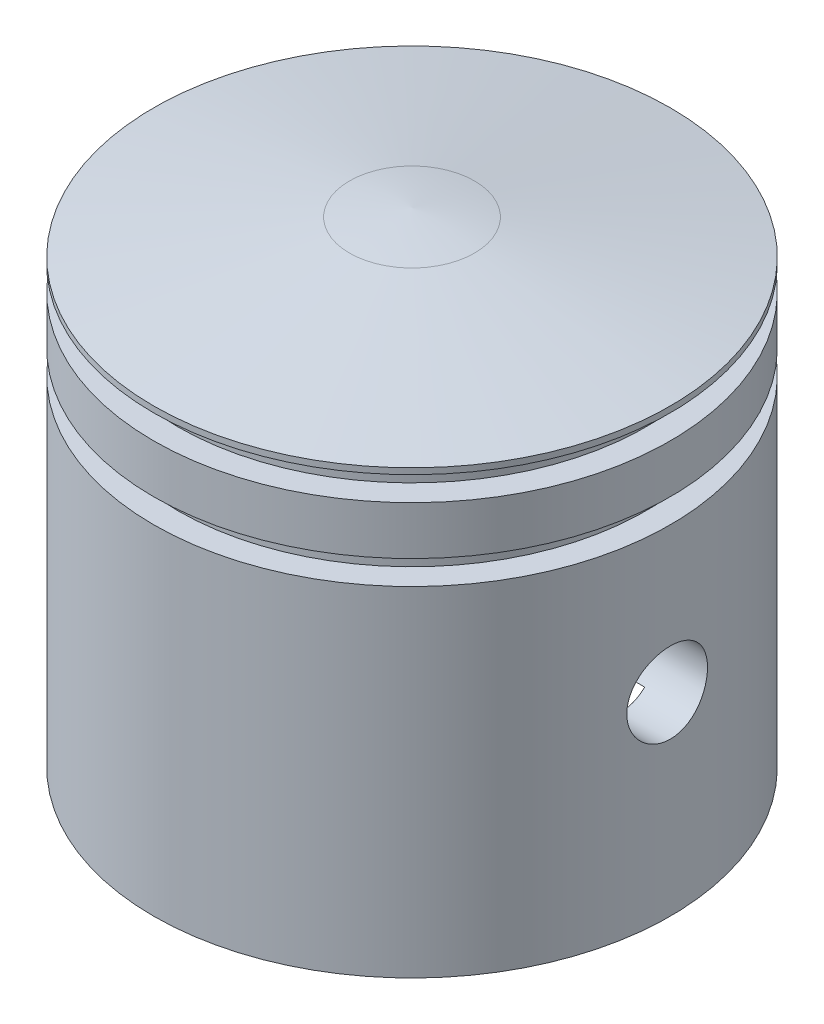
ISO-10303-21;
HEADER;
FILE_DESCRIPTION(('STEP AP214'),'2;1');
FILE_NAME('part.step','',(''),(''),'','','');
FILE_SCHEMA(('AUTOMOTIVE_DESIGN { 1 0 10303 214 1 1 1 1 }'));
ENDSEC;
DATA;
#1=APPLICATION_CONTEXT('core data for automotive mechanical design processes');
#2=APPLICATION_PROTOCOL_DEFINITION('international standard','automotive_design',2000,#1);
#3=PRODUCT_CONTEXT('',#1,'mechanical');
#4=PRODUCT('Part','Part','',(#3));
#5=PRODUCT_RELATED_PRODUCT_CATEGORY('part','',(#4));
#6=PRODUCT_DEFINITION_FORMATION('','',#4);
#7=PRODUCT_DEFINITION_CONTEXT('part definition',#1,'design');
#8=PRODUCT_DEFINITION('design','',#6,#7);
#9=PRODUCT_DEFINITION_SHAPE('','',#8);
#10=(LENGTH_UNIT() NAMED_UNIT(*) SI_UNIT(.MILLI.,.METRE.));
#11=(NAMED_UNIT(*) PLANE_ANGLE_UNIT() SI_UNIT($,.RADIAN.));
#12=(NAMED_UNIT(*) SI_UNIT($,.STERADIAN.) SOLID_ANGLE_UNIT());
#13=UNCERTAINTY_MEASURE_WITH_UNIT(LENGTH_MEASURE(1.E-05),#10,'distance_accuracy_value','');
#14=(GEOMETRIC_REPRESENTATION_CONTEXT(3) GLOBAL_UNCERTAINTY_ASSIGNED_CONTEXT((#13)) GLOBAL_UNIT_ASSIGNED_CONTEXT((#10,
#11,#12)) REPRESENTATION_CONTEXT('',''));
#15=CARTESIAN_POINT('',(0.,0.,0.));
#16=DIRECTION('',(0.,0.,1.));
#17=DIRECTION('',(1.,0.,0.));
#18=AXIS2_PLACEMENT_3D('',#15,#16,#17);
#19=CARTESIAN_POINT('',(0.,10.,0.));
#20=DIRECTION('',(0.,-1.,0.));
#21=DIRECTION('',(0.,0.,-1.));
#22=AXIS2_PLACEMENT_3D('',#19,#20,#21);
#23=PLANE('',#22);
#24=DIRECTION('',(1.,0.,0.));
#25=VECTOR('',#24,1.);
#26=CARTESIAN_POINT('',(-16.,10.,-1.5));
#27=LINE('',#26,#25);
#28=CARTESIAN_POINT('',(-12.913171570145,10.,-1.5));
#29=VERTEX_POINT('',#28);
#30=CARTESIAN_POINT('',(-9.88685996664259,10.,-1.5));
#31=VERTEX_POINT('',#30);
#32=EDGE_CURVE('E63',#29,#31,#27,.T.);
#33=ORIENTED_EDGE('',*,*,#32,.F.);
#34=CARTESIAN_POINT('',(0.,10.,0.));
#35=DIRECTION('',(0.,-1.,0.));
#36=DIRECTION('',(0.,0.,-1.));
#37=AXIS2_PLACEMENT_3D('',#34,#35,#36);
#38=CIRCLE('',#37,13.);
#39=CARTESIAN_POINT('',(12.913171570145,10.,-1.5));
#40=VERTEX_POINT('',#39);
#41=EDGE_CURVE('E153',#29,#40,#38,.T.);
#42=ORIENTED_EDGE('',*,*,#41,.T.);
#43=CARTESIAN_POINT('',(9.88685996664259,10.,-1.5));
#44=VERTEX_POINT('',#43);
#45=EDGE_CURVE('E389',#44,#40,#27,.T.);
#46=ORIENTED_EDGE('',*,*,#45,.F.);
#47=CARTESIAN_POINT('',(0.,10.,0.));
#48=DIRECTION('',(0.,-1.,0.));
#49=DIRECTION('',(0.,0.,-1.));
#50=AXIS2_PLACEMENT_3D('',#47,#48,#49);
#51=CIRCLE('',#50,10.);
#52=EDGE_CURVE('E101',#44,#31,#51,.F.);
#53=ORIENTED_EDGE('',*,*,#52,.T.);
#54=EDGE_LOOP('',(#33,#42,#46,#53));
#55=FACE_BOUND('',#54,.T.);
#56=ADVANCED_FACE('F34',(#55),#23,.T.);
#57=CARTESIAN_POINT('',(0.,30.,0.));
#58=DIRECTION('',(0.,1.,0.));
#59=DIRECTION('',(0.,0.,1.));
#60=AXIS2_PLACEMENT_3D('',#57,#58,#59);
#61=CYLINDRICAL_SURFACE('',#60,16.);
#62=CARTESIAN_POINT('',(0.,27.,0.));
#63=DIRECTION('',(0.,1.,0.));
#64=DIRECTION('',(0.,0.,1.));
#65=AXIS2_PLACEMENT_3D('',#62,#63,#64);
#66=CIRCLE('',#65,16.);
#67=CARTESIAN_POINT('',(0.,27.,16.));
#68=VERTEX_POINT('',#67);
#69=EDGE_CURVE('E182',#68,#68,#66,.T.);
#70=ORIENTED_EDGE('',*,*,#69,.T.);
#71=EDGE_LOOP('',(#70));
#72=FACE_BOUND('',#71,.T.);
#73=CARTESIAN_POINT('',(0.,27.3721526594854,0.));
#74=DIRECTION('',(0.,1.,0.));
#75=DIRECTION('',(0.,0.,1.));
#76=AXIS2_PLACEMENT_3D('',#73,#74,#75);
#77=CIRCLE('',#76,16.);
#78=CARTESIAN_POINT('',(0.,27.3721526594854,-16.));
#79=VERTEX_POINT('',#78);
#80=EDGE_CURVE('E90',#79,#79,#77,.T.);
#81=ORIENTED_EDGE('',*,*,#80,.F.);
#82=EDGE_LOOP('',(#81));
#83=FACE_BOUND('',#82,.T.);
#84=ADVANCED_FACE('F36',(#72,#83),#61,.T.);
#85=CARTESIAN_POINT('',(0.,27.3721526594854,0.));
#86=DIRECTION('',(0.,-1.,0.));
#87=DIRECTION('',(0.,0.,-1.));
#88=AXIS2_PLACEMENT_3D('',#85,#86,#87);
#89=CONICAL_SURFACE('',#88,16.,1.39626340159547);
#90=CARTESIAN_POINT('',(0.,29.5105602774844,0.));
#91=DIRECTION('',(0.,1.,0.));
#92=DIRECTION('',(0.,0.,1.));
#93=AXIS2_PLACEMENT_3D('',#90,#91,#92);
#94=CIRCLE('',#93,3.87248775310959);
#95=CARTESIAN_POINT('',(0.,29.5105602774844,-3.8724877531096));
#96=VERTEX_POINT('',#95);
#97=EDGE_CURVE('E173',#96,#96,#94,.T.);
#98=CARTESIAN_POINT('',(0.,29.5105602774844,-3.8724877531096));
#99=CARTESIAN_POINT('',(0.,29.4882851981303,-3.99881600568138));
#100=CARTESIAN_POINT('',(0.,29.4660101187761,-4.12514425825315));
#101=CARTESIAN_POINT('',(0.,29.4214599600678,-4.37780076339671));
#102=CARTESIAN_POINT('',(0.,29.3991848807136,-4.50412901596848));
#103=CARTESIAN_POINT('',(0.,29.3546347220053,-4.75678552111203));
#104=CARTESIAN_POINT('',(0.,29.3323596426512,-4.8831137736838));
#105=CARTESIAN_POINT('',(0.,29.2878094839429,-5.13577027882736));
#106=CARTESIAN_POINT('',(0.,29.2655344045887,-5.26209853139913));
#107=CARTESIAN_POINT('',(0.,29.2209842458804,-5.51475503654268));
#108=CARTESIAN_POINT('',(0.,29.1987091665262,-5.64108328911446));
#109=CARTESIAN_POINT('',(0.,29.1541590078179,-5.89373979425801));
#110=CARTESIAN_POINT('',(0.,29.1318839284638,-6.02006804682978));
#111=CARTESIAN_POINT('',(0.,29.0873337697554,-6.27272455197333));
#112=CARTESIAN_POINT('',(0.,29.0650586904013,-6.39905280454511));
#113=CARTESIAN_POINT('',(0.,29.020508531693,-6.65170930968866));
#114=CARTESIAN_POINT('',(0.,28.9982334523388,-6.77803756226043));
#115=CARTESIAN_POINT('',(0.,28.9536832936305,-7.03069406740398));
#116=CARTESIAN_POINT('',(0.,28.9314082142764,-7.15702231997576));
#117=CARTESIAN_POINT('',(0.,28.886858055568,-7.40967882511931));
#118=CARTESIAN_POINT('',(0.,28.8645829762139,-7.53600707769108));
#119=CARTESIAN_POINT('',(0.,28.8200328175056,-7.78866358283463));
#120=CARTESIAN_POINT('',(0.,28.7977577381514,-7.91499183540641));
#121=CARTESIAN_POINT('',(0.,28.7532075794431,-8.16764834054996));
#122=CARTESIAN_POINT('',(0.,28.7309325000889,-8.29397659312173));
#123=CARTESIAN_POINT('',(0.,28.6863823413806,-8.54663309826528));
#124=CARTESIAN_POINT('',(0.,28.6641072620265,-8.67296135083706));
#125=CARTESIAN_POINT('',(0.,28.6195571033182,-8.92561785598061));
#126=CARTESIAN_POINT('',(0.,28.597282023964,-9.05194610855238));
#127=CARTESIAN_POINT('',(0.,28.5527318652557,-9.30460261369593));
#128=CARTESIAN_POINT('',(0.,28.5304567859015,-9.43093086626771));
#129=CARTESIAN_POINT('',(0.,28.4859066271932,-9.68358737141126));
#130=CARTESIAN_POINT('',(0.,28.4636315478391,-9.80991562398303));
#131=CARTESIAN_POINT('',(0.,28.4190813891308,-10.0625721291266));
#132=CARTESIAN_POINT('',(0.,28.3968063097766,-10.1889003816984));
#133=CARTESIAN_POINT('',(0.,28.3522561510683,-10.4415568868419));
#134=CARTESIAN_POINT('',(0.,28.3299810717141,-10.5678851394137));
#135=CARTESIAN_POINT('',(0.,28.2854309130058,-10.8205416445572));
#136=CARTESIAN_POINT('',(0.,28.2631558336517,-10.946869897129));
#137=CARTESIAN_POINT('',(0.,28.2186056749433,-11.1995264022726));
#138=CARTESIAN_POINT('',(0.,28.1963305955892,-11.3258546548443));
#139=CARTESIAN_POINT('',(0.,28.1517804368809,-11.5785111599879));
#140=CARTESIAN_POINT('',(0.,28.1295053575267,-11.7048394125597));
#141=CARTESIAN_POINT('',(0.,28.0849551988184,-11.9574959177032));
#142=CARTESIAN_POINT('',(0.,28.0626801194643,-12.083824170275));
#143=CARTESIAN_POINT('',(0.,28.0181299607559,-12.3364806754185));
#144=CARTESIAN_POINT('',(0.,27.9958548814018,-12.4628089279903));
#145=CARTESIAN_POINT('',(0.,27.9513047226935,-12.7154654331339));
#146=CARTESIAN_POINT('',(0.,27.9290296433393,-12.8417936857056));
#147=CARTESIAN_POINT('',(0.,27.884479484631,-13.0944501908492));
#148=CARTESIAN_POINT('',(0.,27.8622044052768,-13.220778443421));
#149=CARTESIAN_POINT('',(0.,27.8176542465685,-13.4734349485645));
#150=CARTESIAN_POINT('',(0.,27.7953791672144,-13.5997632011363));
#151=CARTESIAN_POINT('',(0.,27.7508290085061,-13.8524197062798));
#152=CARTESIAN_POINT('',(0.,27.7285539291519,-13.9787479588516));
#153=CARTESIAN_POINT('',(0.,27.6840037704436,-14.2314044639952));
#154=CARTESIAN_POINT('',(0.,27.6617286910894,-14.3577327165669));
#155=CARTESIAN_POINT('',(0.,27.6171785323811,-14.6103892217105));
#156=CARTESIAN_POINT('',(0.,27.594903453027,-14.7367174742823));
#157=CARTESIAN_POINT('',(0.,27.5503532943187,-14.9893739794258));
#158=CARTESIAN_POINT('',(0.,27.5280782149645,-15.1157022319976));
#159=CARTESIAN_POINT('',(0.,27.4835280562562,-15.3683587371411));
#160=CARTESIAN_POINT('',(0.,27.461252976902,-15.4946869897129));
#161=CARTESIAN_POINT('',(0.,27.4167028181937,-15.7473434948565));
#162=CARTESIAN_POINT('',(0.,27.3944277388396,-15.8736717474282));
#163=CARTESIAN_POINT('',(0.,27.3721526594854,-16.));
#164=B_SPLINE_CURVE_WITH_KNOTS('',3,(#98,#99,#100,#101,#102,#103,#104,#105,#106,#107,#108,#109,
#110,#111,#112,#113,#114,#115,#116,#117,#118,#119,#120,#121,#122,#123,#124,#125,#126,#127,#128,
#129,#130,#131,#132,#133,#134,#135,#136,#137,#138,#139,#140,#141,#142,#143,#144,#145,#146,#147,
#148,#149,#150,#151,#152,#153,#154,#155,#156,#157,#158,#159,#160,#161,#162,#163),.UNSPECIFIED.,
.F.,.F.,(4,2,2,2,2,2,2,2,2,2,2,2,2,2,2,2,2,2,2,2,2,2,2,2,2,2,2,2,2,2,2,2,4),(0.,
0.384831208483213,0.769662416966424,1.15449362544964,1.53932483393285,1.92415604241606,
2.30898725089927,2.69381845938248,3.0786496678657,3.46348087634891,3.84831208483212,
4.23314329331533,4.61797450179855,5.00280571028176,5.38763691876497,5.77246812724818,
6.1572993357314,6.54213054421461,6.92696175269782,7.31179296118103,7.69662416966425,
8.08145537814746,8.46628658663067,8.85111779511388,9.2359490035971,9.62078021208031,
10.0056114205635,10.3904426290467,10.7752738375299,11.1601050460132,11.5449362544964,
11.9297674629796,12.3145986714628),.UNSPECIFIED.);
#165=EDGE_CURVE('BSEAM204',#96,#79,#164,.T.);
#166=ORIENTED_EDGE('',*,*,#97,.F.);
#167=ORIENTED_EDGE('',*,*,#80,.T.);
#168=ORIENTED_EDGE('',*,*,#165,.T.);
#169=ORIENTED_EDGE('',*,*,#165,.F.);
#170=EDGE_LOOP('',(#166,#168,#167,#169));
#171=FACE_BOUND('',#170,.T.);
#172=ADVANCED_FACE('F204',(#171),#89,.T.);
#173=CARTESIAN_POINT('',(0.,-9.88174984300395,-3.07343935356734));
#174=DIRECTION('',(-1.,0.,0.));
#175=DIRECTION('',(0.,0.,1.));
#176=AXIS2_PLACEMENT_3D('',#173,#174,#175);
#177=CIRCLE('',#176,40.);
#178=TRIMMED_CURVE('',#177,(PARAMETER_VALUE(-1.49388453774876)),
(PARAMETER_VALUE(1.49388453774876)),.T.,.PARAMETER.);
#179=CARTESIAN_POINT('',(0.,-9.88174984300395,0.));
#180=DIRECTION('',(0.,1.,0.));
#181=AXIS1_PLACEMENT('',#179,#180);
#182=SURFACE_OF_REVOLUTION('',#178,#181);
#183=CARTESIAN_POINT('',(0.,30.,0.));
#184=VERTEX_POINT('',#183);
#185=VERTEX_LOOP('',#184);
#186=FACE_BOUND('',#185,.T.);
#187=ORIENTED_EDGE('',*,*,#97,.T.);
#188=EDGE_LOOP('',(#187));
#189=FACE_BOUND('',#188,.T.);
#190=ADVANCED_FACE('F195',(#186,#189),#182,.T.);
#191=CARTESIAN_POINT('',(14.5,25.5,0.));
#192=DIRECTION('',(0.,-1.,0.));
#193=DIRECTION('',(0.,0.,-1.));
#194=AXIS2_PLACEMENT_3D('',#191,#192,#193);
#195=PLANE('',#194);
#196=CARTESIAN_POINT('',(0.,25.5,0.));
#197=DIRECTION('',(0.,-1.,0.));
#198=DIRECTION('',(0.,0.,-1.));
#199=AXIS2_PLACEMENT_3D('',#196,#197,#198);
#200=CIRCLE('',#199,14.5);
#201=CARTESIAN_POINT('',(0.,25.5,-14.5));
#202=VERTEX_POINT('',#201);
#203=EDGE_CURVE('E161',#202,#202,#200,.T.);
#204=ORIENTED_EDGE('',*,*,#203,.T.);
#205=EDGE_LOOP('',(#204));
#206=FACE_BOUND('',#205,.T.);
#207=CARTESIAN_POINT('',(0.,25.5,0.));
#208=DIRECTION('',(0.,-1.,0.));
#209=DIRECTION('',(0.,0.,-1.));
#210=AXIS2_PLACEMENT_3D('',#207,#208,#209);
#211=CIRCLE('',#210,16.);
#212=CARTESIAN_POINT('',(0.,25.5,-16.));
#213=VERTEX_POINT('',#212);
#214=EDGE_CURVE('E107',#213,#213,#211,.T.);
#215=ORIENTED_EDGE('',*,*,#214,.F.);
#216=EDGE_LOOP('',(#215));
#217=FACE_BOUND('',#216,.T.);
#218=ADVANCED_FACE('F192',(#206,#217),#195,.F.);
#219=CARTESIAN_POINT('',(14.5,27.,0.));
#220=DIRECTION('',(0.,1.,0.));
#221=DIRECTION('',(0.,0.,1.));
#222=AXIS2_PLACEMENT_3D('',#219,#220,#221);
#223=PLANE('',#222);
#224=CARTESIAN_POINT('',(0.,27.,0.));
#225=DIRECTION('',(0.,-1.,0.));
#226=DIRECTION('',(0.,0.,-1.));
#227=AXIS2_PLACEMENT_3D('',#224,#225,#226);
#228=CIRCLE('',#227,14.5);
#229=CARTESIAN_POINT('',(0.,27.,-14.5));
#230=VERTEX_POINT('',#229);
#231=EDGE_CURVE('E158',#230,#230,#228,.T.);
#232=ORIENTED_EDGE('',*,*,#231,.F.);
#233=EDGE_LOOP('',(#232));
#234=FACE_BOUND('',#233,.T.);
#235=ORIENTED_EDGE('',*,*,#69,.F.);
#236=EDGE_LOOP('',(#235));
#237=FACE_BOUND('',#236,.T.);
#238=ADVANCED_FACE('F194',(#234,#237),#223,.F.);
#239=CARTESIAN_POINT('',(0.,0.,0.));
#240=DIRECTION('',(0.,-1.,0.));
#241=DIRECTION('',(0.,0.,-1.));
#242=AXIS2_PLACEMENT_3D('',#239,#240,#241);
#243=CYLINDRICAL_SURFACE('',#242,14.5);
#244=ORIENTED_EDGE('',*,*,#203,.F.);
#245=EDGE_LOOP('',(#244));
#246=FACE_BOUND('',#245,.T.);
#247=ORIENTED_EDGE('',*,*,#231,.T.);
#248=EDGE_LOOP('',(#247));
#249=FACE_BOUND('',#248,.T.);
#250=ADVANCED_FACE('F202',(#246,#249),#243,.T.);
#251=ORIENTED_EDGE('',*,*,#214,.T.);
#252=EDGE_LOOP('',(#251));
#253=FACE_BOUND('',#252,.T.);
#254=CARTESIAN_POINT('',(0.,22.5,0.));
#255=DIRECTION('',(0.,1.,0.));
#256=DIRECTION('',(0.,0.,1.));
#257=AXIS2_PLACEMENT_3D('',#254,#255,#256);
#258=CIRCLE('',#257,16.);
#259=CARTESIAN_POINT('',(0.,22.5,16.));
#260=VERTEX_POINT('',#259);
#261=EDGE_CURVE('E165',#260,#260,#258,.T.);
#262=ORIENTED_EDGE('',*,*,#261,.T.);
#263=EDGE_LOOP('',(#262));
#264=FACE_BOUND('',#263,.T.);
#265=ADVANCED_FACE('F189',(#253,#264),#61,.T.);
#266=CARTESIAN_POINT('',(14.5,21.,0.));
#267=DIRECTION('',(0.,-1.,0.));
#268=DIRECTION('',(0.,0.,-1.));
#269=AXIS2_PLACEMENT_3D('',#266,#267,#268);
#270=PLANE('',#269);
#271=CARTESIAN_POINT('',(0.,21.,0.));
#272=DIRECTION('',(0.,-1.,0.));
#273=DIRECTION('',(0.,0.,-1.));
#274=AXIS2_PLACEMENT_3D('',#271,#272,#273);
#275=CIRCLE('',#274,14.5);
#276=CARTESIAN_POINT('',(0.,21.,-14.5));
#277=VERTEX_POINT('',#276);
#278=EDGE_CURVE('E162',#277,#277,#275,.T.);
#279=ORIENTED_EDGE('',*,*,#278,.T.);
#280=EDGE_LOOP('',(#279));
#281=FACE_BOUND('',#280,.T.);
#282=CARTESIAN_POINT('',(0.,21.,0.));
#283=DIRECTION('',(0.,-1.,0.));
#284=DIRECTION('',(0.,0.,-1.));
#285=AXIS2_PLACEMENT_3D('',#282,#283,#284);
#286=CIRCLE('',#285,16.);
#287=CARTESIAN_POINT('',(0.,21.,-16.));
#288=VERTEX_POINT('',#287);
#289=EDGE_CURVE('E180',#288,#288,#286,.T.);
#290=ORIENTED_EDGE('',*,*,#289,.F.);
#291=EDGE_LOOP('',(#290));
#292=FACE_BOUND('',#291,.T.);
#293=ADVANCED_FACE('F232',(#281,#292),#270,.F.);
#294=CARTESIAN_POINT('',(14.5,22.5,0.));
#295=DIRECTION('',(0.,1.,0.));
#296=DIRECTION('',(0.,0.,1.));
#297=AXIS2_PLACEMENT_3D('',#294,#295,#296);
#298=PLANE('',#297);
#299=CARTESIAN_POINT('',(0.,22.5,0.));
#300=DIRECTION('',(0.,-1.,0.));
#301=DIRECTION('',(0.,0.,-1.));
#302=AXIS2_PLACEMENT_3D('',#299,#300,#301);
#303=CIRCLE('',#302,14.5);
#304=CARTESIAN_POINT('',(0.,22.5,-14.5));
#305=VERTEX_POINT('',#304);
#306=EDGE_CURVE('E104',#305,#305,#303,.T.);
#307=ORIENTED_EDGE('',*,*,#306,.F.);
#308=EDGE_LOOP('',(#307));
#309=FACE_BOUND('',#308,.T.);
#310=ORIENTED_EDGE('',*,*,#261,.F.);
#311=EDGE_LOOP('',(#310));
#312=FACE_BOUND('',#311,.T.);
#313=ADVANCED_FACE('F237',(#309,#312),#298,.F.);
#314=CARTESIAN_POINT('',(0.,0.,0.));
#315=DIRECTION('',(0.,-1.,0.));
#316=DIRECTION('',(0.,0.,-1.));
#317=AXIS2_PLACEMENT_3D('',#314,#315,#316);
#318=CYLINDRICAL_SURFACE('',#317,14.5);
#319=ORIENTED_EDGE('',*,*,#278,.F.);
#320=EDGE_LOOP('',(#319));
#321=FACE_BOUND('',#320,.T.);
#322=ORIENTED_EDGE('',*,*,#306,.T.);
#323=EDGE_LOOP('',(#322));
#324=FACE_BOUND('',#323,.T.);
#325=ADVANCED_FACE('F227',(#321,#324),#318,.T.);
#326=CARTESIAN_POINT('',(0.,0.,0.));
#327=DIRECTION('',(0.,1.,0.));
#328=DIRECTION('',(0.,0.,1.));
#329=AXIS2_PLACEMENT_3D('',#326,#327,#328);
#330=PLANE('',#329);
#331=CARTESIAN_POINT('',(0.,0.,0.));
#332=DIRECTION('',(0.,-1.,0.));
#333=DIRECTION('',(0.,0.,-1.));
#334=AXIS2_PLACEMENT_3D('',#331,#332,#333);
#335=CIRCLE('',#334,13.);
#336=CARTESIAN_POINT('',(0.,0.,-13.));
#337=VERTEX_POINT('',#336);
#338=EDGE_CURVE('E152',#337,#337,#335,.T.);
#339=ORIENTED_EDGE('',*,*,#338,.F.);
#340=EDGE_LOOP('',(#339));
#341=FACE_BOUND('',#340,.T.);
#342=CARTESIAN_POINT('',(0.,0.,0.));
#343=DIRECTION('',(0.,1.,0.));
#344=DIRECTION('',(0.,0.,1.));
#345=AXIS2_PLACEMENT_3D('',#342,#343,#344);
#346=CIRCLE('',#345,16.);
#347=CARTESIAN_POINT('',(0.,0.,16.));
#348=VERTEX_POINT('',#347);
#349=EDGE_CURVE('E170',#348,#348,#346,.T.);
#350=ORIENTED_EDGE('',*,*,#349,.F.);
#351=EDGE_LOOP('',(#350));
#352=FACE_BOUND('',#351,.T.);
#353=ADVANCED_FACE('F222',(#341,#352),#330,.F.);
#354=CARTESIAN_POINT('',(-16.,14.5,0.));
#355=CARTESIAN_POINT('',(-15.9999977019448,14.4999943017285,0.139515097271033));
#356=CARTESIAN_POINT('',(-15.9981561248574,14.4882818862264,0.279109404865704));
#357=CARTESIAN_POINT('',(-15.9909869809759,14.4417563087232,0.554391314978102));
#358=CARTESIAN_POINT('',(-15.9856560884472,14.4069211074965,0.690075061323317));
#359=CARTESIAN_POINT('',(-15.9721069716578,14.3152203371934,0.953512538047404));
#360=CARTESIAN_POINT('',(-15.9638909956317,14.2583719186384,1.0812723522899));
#361=CARTESIAN_POINT('',(-15.9454779403816,14.1243014548584,1.3254212510446));
#362=CARTESIAN_POINT('',(-15.9352811186255,14.0470820569641,1.44181181036831));
#363=CARTESIAN_POINT('',(-15.9139426841436,13.873766951646,1.66091991165162));
#364=CARTESIAN_POINT('',(-15.9027945139234,13.7775330051098,1.76352747914264));
#365=CARTESIAN_POINT('',(-15.8808607613029,13.5692180517311,1.95120768822823));
#366=CARTESIAN_POINT('',(-15.8700752005075,13.4571361026998,2.03627928654192));
#367=CARTESIAN_POINT('',(-15.8500242812745,13.2195617286563,2.18690544328884));
#368=CARTESIAN_POINT('',(-15.840767397861,13.0940005176382,2.25235273557992));
#369=CARTESIAN_POINT('',(-15.8249120174237,12.8334985891422,2.36118681597065));
#370=CARTESIAN_POINT('',(-15.8183133630222,12.6985584274894,2.40457491010063));
#371=CARTESIAN_POINT('',(-15.8085863451104,12.4242890988562,2.46771559322167));
#372=CARTESIAN_POINT('',(-15.8054302653236,12.2850044141812,2.48765705487496));
#373=CARTESIAN_POINT('',(-15.8028617107177,12.0050328111074,2.50392369757622));
#374=CARTESIAN_POINT('',(-15.8034490028802,11.864345980534,2.50025034860466));
#375=CARTESIAN_POINT('',(-15.8082755045521,11.5869029681473,2.4695458080889));
#376=CARTESIAN_POINT('',(-15.8124817218495,11.4501227766469,2.44272562959693));
#377=CARTESIAN_POINT('',(-15.8240205634547,11.1830279936407,2.36681937833752));
#378=CARTESIAN_POINT('',(-15.8313532830641,11.0527135993595,2.31773262684132));
#379=CARTESIAN_POINT('',(-15.8483550685462,10.8016112873228,2.19846916949384));
#380=CARTESIAN_POINT('',(-15.8580339308724,10.6808662082269,2.12820372315549));
#381=CARTESIAN_POINT('',(-15.878630461501,10.4528004643145,1.96864058146637));
#382=CARTESIAN_POINT('',(-15.8895482178821,10.3454807551125,1.87934153253017));
#383=CARTESIAN_POINT('',(-15.911537862489,10.1460897533667,1.68309088822333));
#384=CARTESIAN_POINT('',(-15.9226101363559,10.0541968417305,1.57595800560539));
#385=CARTESIAN_POINT('',(-15.9435512534783,9.8896668543601,1.34769694737936));
#386=CARTESIAN_POINT('',(-15.9534200906202,9.81702987644317,1.22656870068132));
#387=CARTESIAN_POINT('',(-15.9708539902704,9.69306192657761,0.973595927056491));
#388=CARTESIAN_POINT('',(-15.9784174854193,9.641745441467,0.84174418624046));
#389=CARTESIAN_POINT('',(-15.9903756000068,9.56203403255277,0.571149534696759));
#390=CARTESIAN_POINT('',(-15.9947704520898,9.53363742593352,0.4324071306872));
#391=CARTESIAN_POINT('',(-15.9998651172728,9.50081072354981,0.153508336763735));
#392=CARTESIAN_POINT('',(-16.0006027179286,9.49613552102382,0.0133814615087023));
#393=CARTESIAN_POINT('',(-15.9984028649127,9.51023270533598,-0.265654546411642));
#394=CARTESIAN_POINT('',(-15.9954655349964,9.52900430258911,-0.404563719925156));
#395=CARTESIAN_POINT('',(-15.9862692369322,9.58925838768018,-0.676473446265704));
#396=CARTESIAN_POINT('',(-15.9800278421539,9.63062075826773,-0.809501262056041));
#397=CARTESIAN_POINT('',(-15.9649207568356,9.73475509439879,-1.06673406785663));
#398=CARTESIAN_POINT('',(-15.9560549341007,9.79752813844267,-1.19093861303941));
#399=CARTESIAN_POINT('',(-15.9365897274094,9.94327199112658,-1.42807220225041));
#400=CARTESIAN_POINT('',(-15.9259772866342,10.0263974200905,-1.54090512378372));
#401=CARTESIAN_POINT('',(-15.9042388046444,10.2102720859078,-1.75110696507806));
#402=CARTESIAN_POINT('',(-15.8931127309268,10.3110224392049,-1.84847490447018));
#403=CARTESIAN_POINT('',(-15.8714802753665,10.5283811972172,-2.02588080776691));
#404=CARTESIAN_POINT('',(-15.860980411908,10.6451248471223,-2.10575398584126));
#405=CARTESIAN_POINT('',(-15.8419069280583,10.8905160736613,-2.2447556772664));
#406=CARTESIAN_POINT('',(-15.83333325222,11.0191633074895,-2.30388478778105));
#407=CARTESIAN_POINT('',(-15.8191307135236,11.2842296407142,-2.39946771944995));
#408=CARTESIAN_POINT('',(-15.8134908234896,11.4206174687656,-2.43600654947912));
#409=CARTESIAN_POINT('',(-15.8057657028079,11.697689143664,-2.48564122040535));
#410=CARTESIAN_POINT('',(-15.8036802038444,11.838372665419,-2.49873883084997));
#411=CARTESIAN_POINT('',(-15.8033105804489,12.1183987159075,-2.50107452690756));
#412=CARTESIAN_POINT('',(-15.804985160429,12.2577390969335,-2.49057180548425));
#413=CARTESIAN_POINT('',(-15.8118569894183,12.5326452971443,-2.44656223255901));
#414=CARTESIAN_POINT('',(-15.8170542307995,12.6682111245017,-2.41305543086961));
#415=CARTESIAN_POINT('',(-15.8303708885491,12.9316378266405,-2.32408329891852));
#416=CARTESIAN_POINT('',(-15.8384876895341,13.0595054782584,-2.26863761738581));
#417=CARTESIAN_POINT('',(-15.856731840474,13.3041656136763,-2.13738768546417));
#418=CARTESIAN_POINT('',(-15.8668592701083,13.4209576582884,-2.06158262820886));
#419=CARTESIAN_POINT('',(-15.8881156809226,13.6414655441268,-1.8908300813908));
#420=CARTESIAN_POINT('',(-15.8992540116029,13.7450321966138,-1.79569107094768));
#421=CARTESIAN_POINT('',(-15.9212004364073,13.9348212363867,-1.58937594638204));
#422=CARTESIAN_POINT('',(-15.9320084534012,14.0210395985919,-1.47819612078432));
#423=CARTESIAN_POINT('',(-15.952151024567,14.1741512230316,-1.24216685884342));
#424=CARTESIAN_POINT('',(-15.9614763443027,14.2409253727596,-1.11723937214238));
#425=CARTESIAN_POINT('',(-15.9775125983888,14.3524409961929,-0.857851882357785));
#426=CARTESIAN_POINT('',(-15.9842262014212,14.3972049725584,-0.723401776581763));
#427=CARTESIAN_POINT('',(-15.9927744586488,14.4534330210906,-0.490314239911595));
#428=CARTESIAN_POINT('',(-15.9954699162612,14.470868490629,-0.393105575651625));
#429=CARTESIAN_POINT('',(-15.9990834869762,14.4941539133791,-0.197277797850582));
#430=CARTESIAN_POINT('',(-16.0000016250797,14.5000040295573,-0.0986587041691187));
#431=CARTESIAN_POINT('',(-16.,14.5,0.));
#432=B_SPLINE_CURVE_WITH_KNOTS('',3,(#354,#355,#356,#357,#358,#359,#360,#361,#362,#363,#364,
#365,#366,#367,#368,#369,#370,#371,#372,#373,#374,#375,#376,#377,#378,#379,#380,#381,#382,#383,
#384,#385,#386,#387,#388,#389,#390,#391,#392,#393,#394,#395,#396,#397,#398,#399,#400,#401,#402,
#403,#404,#405,#406,#407,#408,#409,#410,#411,#412,#413,#414,#415,#416,#417,#418,#419,#420,#421,
#422,#423,#424,#425,#426,#427,#428,#429,#430,#431),.UNSPECIFIED.,.T.,.F.,(4,2,2,2,2,2,2,2,2,2,2,
2,2,2,2,2,2,2,2,2,2,2,2,2,2,2,2,2,2,2,2,2,2,2,2,2,2,2,4),(0.,0.418184740477491,
0.836768642528014,1.25502707944103,1.6732311879203,2.09459568152199,2.51598523645422,
2.93963778605759,3.36326525009238,3.78345631134994,4.20362121670545,4.6199957602258,
5.03638299651051,5.45453977402347,5.87272629892068,6.29545732334367,6.71819049513827,
7.14121043754565,7.56419931829866,7.98280854005915,8.40140366528357,8.81779444756567,
9.23420620742031,9.65388541469672,10.0735912160142,10.4970948024959,10.9205861964898,
11.3424741039513,11.764330162293,12.1815758159869,12.598820566189,13.0156924696662,
13.4325808967135,13.8538201231554,14.275156971423,14.6990230419984,15.1224548565628,
15.4181801635154,15.7139013105871),.UNSPECIFIED.);
#433=CARTESIAN_POINT('',(-16.,14.5,0.));
#434=VERTEX_POINT('',#433);
#435=EDGE_CURVE('E146',#434,#434,#432,.T.);
#436=ORIENTED_EDGE('',*,*,#435,.T.);
#437=EDGE_LOOP('',(#436));
#438=FACE_BOUND('',#437,.T.);
#439=CARTESIAN_POINT('',(15.8034806292791,12.,-2.5));
#440=CARTESIAN_POINT('',(15.8034830346333,11.860496621659,-2.49999429179104));
#441=CARTESIAN_POINT('',(15.8053478026579,11.7209140023147,-2.48828377742084));
#442=CARTESIAN_POINT('',(15.8125997089633,11.4456563709971,-2.44176643645043));
#443=CARTESIAN_POINT('',(15.8179902148259,11.3099852245206,-2.40693752801736));
#444=CARTESIAN_POINT('',(15.8316684916184,11.0465744103556,-2.31525516047132));
#445=CARTESIAN_POINT('',(15.8399539668268,10.9188285521292,-2.25841914921922));
#446=CARTESIAN_POINT('',(15.8584858981599,10.6747031091579,-2.12437791816389));
#447=CARTESIAN_POINT('',(15.8687321022282,10.5583220663405,-2.04717531605122));
#448=CARTESIAN_POINT('',(15.8901303851737,10.3392035148487,-1.87387730110911));
#449=CARTESIAN_POINT('',(15.9012888784462,10.2365789256004,-1.777639886175));
#450=CARTESIAN_POINT('',(15.9231973082666,10.0488657795701,-1.56931080987672));
#451=CARTESIAN_POINT('',(15.9339472216984,9.96377821377571,-1.45721825316848));
#452=CARTESIAN_POINT('',(15.9538946715316,9.81313512295885,-1.21963429185761));
#453=CARTESIAN_POINT('',(15.9630838016344,9.74768399602554,-1.09407592635729));
#454=CARTESIAN_POINT('',(15.978803149105,9.63884204527492,-0.833580171794756));
#455=CARTESIAN_POINT('',(15.9853335186778,9.59544995861733,-0.698643320136811));
#456=CARTESIAN_POINT('',(15.9949542857973,9.53230128104384,-0.424385325448812));
#457=CARTESIAN_POINT('',(15.9980722260505,9.51235535093165,-0.285108760160752));
#458=CARTESIAN_POINT('',(16.0006113098095,9.49607695669663,-0.00515314355067112));
#459=CARTESIAN_POINT('',(16.0000326754547,9.49974307364815,0.135525822989187));
#460=CARTESIAN_POINT('',(15.9952657389869,9.53043592627786,0.413000089722151));
#461=CARTESIAN_POINT('',(15.9911089169598,9.55725893884032,0.549818542575174));
#462=CARTESIAN_POINT('',(15.9796877395528,9.63318402862262,0.816988375343491));
#463=CARTESIAN_POINT('',(15.9724232987387,9.68228671835413,0.947339577352174));
#464=CARTESIAN_POINT('',(15.9555491842028,9.80158365586005,1.19848742679247));
#465=CARTESIAN_POINT('',(15.9459300777042,9.87186300542795,1.31924299071837));
#466=CARTESIAN_POINT('',(15.9254174702046,10.0314560806292,1.54732385653213));
#467=CARTESIAN_POINT('',(15.9145238783282,10.120771163955,1.65464819959324));
#468=CARTESIAN_POINT('',(15.8925387825556,10.3170334870733,1.85402198520023));
#469=CARTESIAN_POINT('',(15.8814464071021,10.4241586663949,1.94589625613074));
#470=CARTESIAN_POINT('',(15.8604269384475,10.6523975646821,2.11039226047485));
#471=CARTESIAN_POINT('',(15.8504998536298,10.7735113842741,2.18301385538335));
#472=CARTESIAN_POINT('',(15.8329349281613,11.0264796281058,2.30697060635685));
#473=CARTESIAN_POINT('',(15.8252991458489,11.1583435750735,2.35828663884161));
#474=CARTESIAN_POINT('',(15.8132168990948,11.4289648487055,2.43799343127668));
#475=CARTESIAN_POINT('',(15.8087701897074,11.5677216450697,2.46638595195258));
#476=CARTESIAN_POINT('',(15.8036163696886,11.8466281032752,2.49919719237856));
#477=CARTESIAN_POINT('',(15.80287044806,11.9867478001948,2.50386473411271));
#478=CARTESIAN_POINT('',(15.8050994977182,12.2657676352979,2.48975479033184));
#479=CARTESIAN_POINT('',(15.8080743433524,12.4046678145059,2.47097809654328));
#480=CARTESIAN_POINT('',(15.8173740105186,12.6765278074665,2.41072412555896));
#481=CARTESIAN_POINT('',(15.8236803883335,12.8095159986396,2.36937178781979));
#482=CARTESIAN_POINT('',(15.8389172439685,13.0666739711039,2.26527072241932));
#483=CARTESIAN_POINT('',(15.8478478614411,13.190843282649,2.20252085602949));
#484=CARTESIAN_POINT('',(15.8674179220711,13.4279512816488,2.05681199170293));
#485=CARTESIAN_POINT('',(15.8780706945976,13.5407902289,1.97369251093471));
#486=CARTESIAN_POINT('',(15.8998450469621,13.7510069808482,1.78982593995283));
#487=CARTESIAN_POINT('',(15.9109666556111,13.848383833607,1.68907776521421));
#488=CARTESIAN_POINT('',(15.9325473887455,14.0258112706355,1.47171546765808));
#489=CARTESIAN_POINT('',(15.9429995842164,14.1056965764301,1.35496564158984));
#490=CARTESIAN_POINT('',(15.9619548934084,14.2447195199902,1.10955861029337));
#491=CARTESIAN_POINT('',(15.9704580640831,14.3038577640459,0.980901753162492));
#492=CARTESIAN_POINT('',(15.9845269767683,14.3994462752842,0.715839663778326));
#493=CARTESIAN_POINT('',(15.9901042225572,14.4359854974394,0.579467147617088));
#494=CARTESIAN_POINT('',(15.9977412978946,14.4856261326728,0.302427949770744));
#495=CARTESIAN_POINT('',(15.9998013804089,14.498729231356,0.161761577654429));
#496=CARTESIAN_POINT('',(16.0001691012796,14.5010818526552,-0.118272165188272));
#497=CARTESIAN_POINT('',(15.9985164403994,14.4905837446428,-0.257637428859787));
#498=CARTESIAN_POINT('',(15.9917247801431,14.4465746838196,-0.532594595464883));
#499=CARTESIAN_POINT('',(15.9865857947973,14.4130638236216,-0.668186513581642));
#500=CARTESIAN_POINT('',(15.9733964142131,14.3240727402876,-0.931668850429402));
#501=CARTESIAN_POINT('',(15.965348528289,14.2686114484191,-1.05956579651625));
#502=CARTESIAN_POINT('',(15.947223323121,14.137321161478,-1.30427807253219));
#503=CARTESIAN_POINT('',(15.9371459268214,14.0614913930258,-1.42109298145458));
#504=CARTESIAN_POINT('',(15.9159528222148,13.8907105567916,-1.64160219185804));
#505=CARTESIAN_POINT('',(15.9048276353277,13.795573685696,-1.745151694824));
#506=CARTESIAN_POINT('',(15.8828612878644,13.5892700426646,-1.93490712736948));
#507=CARTESIAN_POINT('',(15.8720201944801,13.4780995182753,-2.02110898563013));
#508=CARTESIAN_POINT('',(15.8517779742959,13.2420788957246,-2.17420151541622));
#509=CARTESIAN_POINT('',(15.842386091806,13.1171490413903,-2.24097044145097));
#510=CARTESIAN_POINT('',(15.8262143333515,12.85775678237,-2.35247565604314));
#511=CARTESIAN_POINT('',(15.8194317848938,12.7233042988834,-2.3972345005847));
#512=CARTESIAN_POINT('',(15.8107909670081,12.4902302603036,-2.45344906957713));
#513=CARTESIAN_POINT('',(15.8080643798014,12.3930384000151,-2.47087849275467));
#514=CARTESIAN_POINT('',(15.8044083737681,12.1972442189536,-2.49415589078729));
#515=CARTESIAN_POINT('',(15.8034789284691,12.0986419189782,-2.50000403623692));
#516=CARTESIAN_POINT('',(15.8034806292791,12.,-2.5));
#517=B_SPLINE_CURVE_WITH_KNOTS('',3,(#439,#440,#441,#442,#443,#444,#445,#446,#447,#448,#449,
#450,#451,#452,#453,#454,#455,#456,#457,#458,#459,#460,#461,#462,#463,#464,#465,#466,#467,#468,
#469,#470,#471,#472,#473,#474,#475,#476,#477,#478,#479,#480,#481,#482,#483,#484,#485,#486,#487,
#488,#489,#490,#491,#492,#493,#494,#495,#496,#497,#498,#499,#500,#501,#502,#503,#504,#505,#506,
#507,#508,#509,#510,#511,#512,#513,#514,#515,#516),.UNSPECIFIED.,.T.,.F.,(4,2,2,2,2,2,2,2,2,2,2,
2,2,2,2,2,2,2,2,2,2,2,2,2,2,2,2,2,2,2,2,2,2,2,2,2,2,2,4),(0.,0.418149527902241,
0.836699032574077,1.25491737645053,1.67308199345223,2.09449258051085,2.51592697424482,
2.93956378022295,3.36317633102573,3.78334397517517,4.20348637030326,4.61996979150785,
5.03646466334576,5.45465612930833,5.87287743207563,6.29556043395287,6.71824647655855,
7.14131110038651,7.56434322607052,7.98292940034458,8.40150143908464,8.81778013452041,
9.23408098683358,9.65377352836981,10.0734918986585,10.4970197199928,10.9205351635679,
11.3423727623224,11.7641800198745,12.18149834073,12.5988149821383,13.0157724881518,
13.432745828047,13.8539404040181,14.275233715164,14.6991122166338,15.1225554163993,
15.4182305458031,15.7139013198206),.UNSPECIFIED.);
#518=CARTESIAN_POINT('',(15.8034806292791,12.,-2.5));
#519=VERTEX_POINT('',#518);
#520=EDGE_CURVE('E141',#519,#519,#517,.T.);
#521=ORIENTED_EDGE('',*,*,#520,.T.);
#522=EDGE_LOOP('',(#521));
#523=FACE_BOUND('',#522,.T.);
#524=ORIENTED_EDGE('',*,*,#289,.T.);
#525=EDGE_LOOP('',(#524));
#526=FACE_BOUND('',#525,.T.);
#527=ORIENTED_EDGE('',*,*,#349,.T.);
#528=EDGE_LOOP('',(#527));
#529=FACE_BOUND('',#528,.T.);
#530=ADVANCED_FACE('F213',(#438,#523,#526,#529),#61,.T.);
#531=DIRECTION('',(1.,0.,0.));
#532=VECTOR('',#531,1.);
#533=CARTESIAN_POINT('',(-16.,10.,1.5));
#534=LINE('',#533,#532);
#535=CARTESIAN_POINT('',(12.913171570145,10.,1.5));
#536=VERTEX_POINT('',#535);
#537=CARTESIAN_POINT('',(9.88685996664259,10.,1.5));
#538=VERTEX_POINT('',#537);
#539=EDGE_CURVE('E56',#536,#538,#534,.F.);
#540=ORIENTED_EDGE('',*,*,#539,.F.);
#541=CARTESIAN_POINT('',(-12.913171570145,10.,1.5));
#542=VERTEX_POINT('',#541);
#543=EDGE_CURVE('E97',#536,#542,#38,.T.);
#544=ORIENTED_EDGE('',*,*,#543,.T.);
#545=CARTESIAN_POINT('',(-9.88685996664259,10.,1.5));
#546=VERTEX_POINT('',#545);
#547=EDGE_CURVE('E84',#546,#542,#534,.F.);
#548=ORIENTED_EDGE('',*,*,#547,.F.);
#549=EDGE_CURVE('E95',#546,#538,#51,.F.);
#550=ORIENTED_EDGE('',*,*,#549,.T.);
#551=EDGE_LOOP('',(#540,#544,#548,#550));
#552=FACE_BOUND('',#551,.T.);
#553=ADVANCED_FACE('F94',(#552),#23,.T.);
#554=CARTESIAN_POINT('',(0.,10.,0.));
#555=DIRECTION('',(0.,-1.,0.));
#556=DIRECTION('',(0.,0.,-1.));
#557=AXIS2_PLACEMENT_3D('',#554,#555,#556);
#558=CYLINDRICAL_SURFACE('',#557,13.);
#559=ORIENTED_EDGE('',*,*,#41,.F.);
#560=CARTESIAN_POINT('',(-12.913171570145,10.,-1.5));
#561=CARTESIAN_POINT('',(-12.9196464939997,9.95820085358915,-1.44426579878659));
#562=CARTESIAN_POINT('',(-12.9259549192278,9.91874092086907,-1.38679796540747));
#563=CARTESIAN_POINT('',(-12.9380773902685,9.84473133764257,-1.26873073828123));
#564=CARTESIAN_POINT('',(-12.9438914163828,9.81018188274731,-1.20813121991303));
#565=CARTESIAN_POINT('',(-12.9603404608392,9.71430178140072,-1.02224257355282));
#566=CARTESIAN_POINT('',(-12.9699930765876,9.66067330241013,-0.892775127826518));
#567=CARTESIAN_POINT('',(-12.9855839172602,9.57571702553779,-0.626442746105629));
#568=CARTESIAN_POINT('',(-12.9915189085937,9.54440863841842,-0.489571482352221));
#569=CARTESIAN_POINT('',(-12.9990013032835,9.50512260914373,-0.212467802603064));
#570=CARTESIAN_POINT('',(-13.0005515461425,9.49712986799228,-0.0722376211678123));
#571=CARTESIAN_POINT('',(-12.9991042541622,9.50466026890764,0.206029683769606));
#572=CARTESIAN_POINT('',(-12.996155887224,9.51992916830979,0.344074092382287));
#573=CARTESIAN_POINT('',(-12.986125153176,9.57304239783094,0.615650842540818));
#574=CARTESIAN_POINT('',(-12.9790411747057,9.61089552758196,0.749181403888349));
#575=CARTESIAN_POINT('',(-12.9627490398878,9.70119099514041,0.989738928879762));
#576=CARTESIAN_POINT('',(-12.9539797808047,9.75083257474323,1.09785208331175));
#577=CARTESIAN_POINT('',(-12.9395107443663,9.83627154609569,1.25371177293855));
#578=CARTESIAN_POINT('',(-12.9344702910731,9.86656964555138,1.30459866498264));
#579=CARTESIAN_POINT('',(-12.9240502172861,9.9306832908871,1.4040757561164));
#580=CARTESIAN_POINT('',(-12.9186705698196,9.96449911663509,1.45266577202019));
#581=CARTESIAN_POINT('',(-12.913171570145,10.,1.5));
#582=B_SPLINE_CURVE_WITH_KNOTS('',3,(#560,#561,#562,#563,#564,#565,#566,#567,#568,#569,#570,
#571,#572,#573,#574,#575,#576,#577,#578,#579,#580,#581),.UNSPECIFIED.,.F.,.F.,(4,2,2,2,2,2,2,2,
2,2,4),(0.,0.209776062140149,0.419560478466375,0.838801230764256,1.25840613426738,
1.67773924513587,2.09252194041192,2.50746635565219,2.86404950501363,3.04223164009906,
3.22042796209395),.UNSPECIFIED.);
#583=EDGE_CURVE('E128',#29,#542,#582,.T.);
#584=ORIENTED_EDGE('',*,*,#583,.T.);
#585=ORIENTED_EDGE('',*,*,#543,.F.);
#586=CARTESIAN_POINT('',(12.913171570145,10.,1.5));
#587=CARTESIAN_POINT('',(12.9196464939997,9.95820085358915,1.44426579878659));
#588=CARTESIAN_POINT('',(12.9259549192278,9.91874092086907,1.38679796540747));
#589=CARTESIAN_POINT('',(12.9380773902685,9.84473133764257,1.26873073828123));
#590=CARTESIAN_POINT('',(12.9438914163828,9.81018188274731,1.20813121991303));
#591=CARTESIAN_POINT('',(12.9603404608392,9.71430178140072,1.02224257355282));
#592=CARTESIAN_POINT('',(12.9699930765876,9.66067330241013,0.892775127826518));
#593=CARTESIAN_POINT('',(12.9855839172602,9.57571702553779,0.626442746105629));
#594=CARTESIAN_POINT('',(12.9915189085937,9.54440863841842,0.489571482352221));
#595=CARTESIAN_POINT('',(12.9990013032835,9.50512260914373,0.212467802603064));
#596=CARTESIAN_POINT('',(13.0005515461425,9.49712986799228,0.0722376211678123));
#597=CARTESIAN_POINT('',(12.9991042541622,9.50466026890764,-0.206029683769606));
#598=CARTESIAN_POINT('',(12.996155887224,9.51992916830979,-0.344074092382287));
#599=CARTESIAN_POINT('',(12.986125153176,9.57304239783094,-0.615650842540818));
#600=CARTESIAN_POINT('',(12.9790411747057,9.61089552758196,-0.749181403888349));
#601=CARTESIAN_POINT('',(12.9627490398878,9.70119099514041,-0.989738928879762));
#602=CARTESIAN_POINT('',(12.9539797808047,9.75083257474323,-1.09785208331175));
#603=CARTESIAN_POINT('',(12.9395107443663,9.83627154609569,-1.25371177293855));
#604=CARTESIAN_POINT('',(12.9344702910731,9.86656964555138,-1.30459866498264));
#605=CARTESIAN_POINT('',(12.9240502172861,9.9306832908871,-1.4040757561164));
#606=CARTESIAN_POINT('',(12.9186705698196,9.96449911663509,-1.45266577202019));
#607=CARTESIAN_POINT('',(12.913171570145,10.,-1.5));
#608=B_SPLINE_CURVE_WITH_KNOTS('',3,(#586,#587,#588,#589,#590,#591,#592,#593,#594,#595,#596,
#597,#598,#599,#600,#601,#602,#603,#604,#605,#606,#607),.UNSPECIFIED.,.F.,.F.,(4,2,2,2,2,2,2,2,
2,2,4),(0.,0.209776062140149,0.419560478466375,0.838801230764256,1.25840613426738,
1.67773924513587,2.09252194041192,2.50746635565219,2.86404950501363,3.04223164009906,
3.22042796209395),.UNSPECIFIED.);
#609=EDGE_CURVE('E135',#536,#40,#608,.T.);
#610=ORIENTED_EDGE('',*,*,#609,.T.);
#611=EDGE_LOOP('',(#559,#584,#585,#610));
#612=FACE_BOUND('',#611,.T.);
#613=ORIENTED_EDGE('',*,*,#338,.T.);
#614=EDGE_LOOP('',(#613));
#615=FACE_BOUND('',#614,.T.);
#616=ADVANCED_FACE('F215',(#612,#615),#558,.F.);
#617=CARTESIAN_POINT('',(0.,24.,0.));
#618=DIRECTION('',(0.,-1.,0.));
#619=DIRECTION('',(0.,0.,-1.));
#620=AXIS2_PLACEMENT_3D('',#617,#618,#619);
#621=PLANE('',#620);
#622=CARTESIAN_POINT('',(0.,24.,0.));
#623=DIRECTION('',(0.,-1.,0.));
#624=DIRECTION('',(0.,0.,-1.));
#625=AXIS2_PLACEMENT_3D('',#622,#623,#624);
#626=CIRCLE('',#625,10.);
#627=CARTESIAN_POINT('',(0.,24.,-10.));
#628=VERTEX_POINT('',#627);
#629=EDGE_CURVE('E100',#628,#628,#626,.T.);
#630=ORIENTED_EDGE('',*,*,#629,.T.);
#631=EDGE_LOOP('',(#630));
#632=FACE_BOUND('',#631,.T.);
#633=ADVANCED_FACE('F220',(#632),#621,.T.);
#634=CARTESIAN_POINT('',(0.,24.,0.));
#635=DIRECTION('',(0.,-1.,0.));
#636=DIRECTION('',(0.,0.,-1.));
#637=AXIS2_PLACEMENT_3D('',#634,#635,#636);
#638=CYLINDRICAL_SURFACE('',#637,10.);
#639=ORIENTED_EDGE('',*,*,#629,.F.);
#640=EDGE_LOOP('',(#639));
#641=FACE_BOUND('',#640,.T.);
#642=ORIENTED_EDGE('',*,*,#52,.F.);
#643=CARTESIAN_POINT('',(9.88685996664259,10.,-1.5));
#644=CARTESIAN_POINT('',(9.87829702632978,10.0423381044855,-1.55644775774642));
#645=CARTESIAN_POINT('',(9.8695164098382,10.0870272455987,-1.61105469283506));
#646=CARTESIAN_POINT('',(9.85176215376839,10.1808382203519,-1.71628235343695));
#647=CARTESIAN_POINT('',(9.84278851814074,10.2299599633339,-1.76690316043694));
#648=CARTESIAN_POINT('',(9.8159502550057,10.3835199248386,-1.91228287155091));
#649=CARTESIAN_POINT('',(9.79815893076327,10.4941971430423,-2.00061796766923));
#650=CARTESIAN_POINT('',(9.76481433608198,10.7291280421412,-2.15751587055995));
#651=CARTESIAN_POINT('',(9.74926267017561,10.8533913453404,-2.22606453693198));
#652=CARTESIAN_POINT('',(9.72224025261607,11.1120506879739,-2.34127318968291));
#653=CARTESIAN_POINT('',(9.7107671007491,11.246440711182,-2.38794605518357));
#654=CARTESIAN_POINT('',(9.6934351616116,11.5194319951237,-2.45735418339059));
#655=CARTESIAN_POINT('',(9.6874935617474,11.6579379985205,-2.48044304897375));
#656=CARTESIAN_POINT('',(9.68165898643259,11.937005984586,-2.50312290551809));
#657=CARTESIAN_POINT('',(9.68176622057743,12.0775680383293,-2.50271308223672));
#658=CARTESIAN_POINT('',(9.68793593914431,12.3529816746888,-2.47871632829885));
#659=CARTESIAN_POINT('',(9.69384866853871,12.4878879868879,-2.45571222118534));
#660=CARTESIAN_POINT('',(9.71071117534564,12.7518469398539,-2.38815579017542));
#661=CARTESIAN_POINT('',(9.72166092471398,12.8808996132072,-2.34360358625042));
#662=CARTESIAN_POINT('',(9.74746560596719,13.1307885670213,-2.23385335557449));
#663=CARTESIAN_POINT('',(9.7623529195144,13.2515457436194,-2.16848317197037));
#664=CARTESIAN_POINT('',(9.79434578612789,13.4805714327983,-2.01906213967446));
#665=CARTESIAN_POINT('',(9.81145177041249,13.5888375098736,-1.93500765725064));
#666=CARTESIAN_POINT('',(9.84655716119831,13.7930738176455,-1.74774822886379));
#667=CARTESIAN_POINT('',(9.86456812118589,13.8886024628581,-1.64406327335133));
#668=CARTESIAN_POINT('',(9.89902179366731,14.0610160403167,-1.42196244073076));
#669=CARTESIAN_POINT('',(9.91546444768792,14.1379002775831,-1.30354601474861));
#670=CARTESIAN_POINT('',(9.94504061645413,14.2711428922548,-1.05449104713443));
#671=CARTESIAN_POINT('',(9.95815689068242,14.3273949788563,-0.923793454785755));
#672=CARTESIAN_POINT('',(9.97947886085677,14.4170037555349,-0.654395587270723));
#673=CARTESIAN_POINT('',(9.98768547304251,14.4503647177176,-0.515696810583525));
#674=CARTESIAN_POINT('',(9.99811008554861,14.492511399187,-0.237953144489439));
#675=CARTESIAN_POINT('',(10.000472783337,14.5018911060145,-0.0990037399750364));
#676=CARTESIAN_POINT('',(9.99936924845989,14.4974769837093,0.178494017362685));
#677=CARTESIAN_POINT('',(9.9959035931882,14.4836854500677,0.317042408550894));
#678=CARTESIAN_POINT('',(9.98363158834437,14.4338166174374,0.587489627768107));
#679=CARTESIAN_POINT('',(9.97491213094045,14.398101730266,0.719459604109864));
#680=CARTESIAN_POINT('',(9.95313476079063,14.3058384175761,0.975517412390961));
#681=CARTESIAN_POINT('',(9.94007644385454,14.2492880510571,1.09960450871051));
#682=CARTESIAN_POINT('',(9.91073923754746,14.1159019692027,1.33865740980875));
#683=CARTESIAN_POINT('',(9.89441061986185,14.0387459906073,1.45343824787646));
#684=CARTESIAN_POINT('',(9.86040263626624,13.8667177176332,1.66863689951077));
#685=CARTESIAN_POINT('',(9.84272302915515,13.7718422552908,1.76905213905724));
#686=CARTESIAN_POINT('',(9.80745084022131,13.5642240624884,1.95528314890227));
#687=CARTESIAN_POINT('',(9.78987165809029,13.4510916023801,2.04066765914235));
#688=CARTESIAN_POINT('',(9.75727211093037,13.2117695504121,2.19125512858105));
#689=CARTESIAN_POINT('',(9.7422516273326,13.0855805640214,2.25645902305417));
#690=CARTESIAN_POINT('',(9.71660606378031,12.8241689441377,2.36445617235024));
#691=CARTESIAN_POINT('',(9.70596195913239,12.6889884439287,2.40734664724386));
#692=CARTESIAN_POINT('',(9.690285382318,12.4130147047863,2.4697005191477));
#693=CARTESIAN_POINT('',(9.68525196910656,12.272222411187,2.48916784481465));
#694=CARTESIAN_POINT('',(9.681485324806,11.993351206597,2.50377586091762));
#695=CARTESIAN_POINT('',(9.68257592473742,11.855309944987,2.49959675920337));
#696=CARTESIAN_POINT('',(9.69051463097382,11.5819844112358,2.46863857730251));
#697=CARTESIAN_POINT('',(9.69736172755085,11.4466996598465,2.44186346060474));
#698=CARTESIAN_POINT('',(9.7159273203141,11.1837046528562,2.36690028143319));
#699=CARTESIAN_POINT('',(9.7276078655847,11.0559440558689,2.31887884039046));
#700=CARTESIAN_POINT('',(9.75452243524015,10.8101859662753,2.20291272179486));
#701=CARTESIAN_POINT('',(9.76975797816177,10.692192675089,2.13495952708639));
#702=CARTESIAN_POINT('',(9.80205872758479,10.4694963184945,1.98134844584284));
#703=CARTESIAN_POINT('',(9.81911397671682,10.3647271454983,1.89578474961086));
#704=CARTESIAN_POINT('',(9.8447745214587,10.2190217365953,1.755753626632));
#705=CARTESIAN_POINT('',(9.85334316782526,10.172350926578,1.70711514965063));
#706=CARTESIAN_POINT('',(9.870294132368,10.0830705460944,1.60621122310691));
#707=CARTESIAN_POINT('',(9.87867644573856,10.0404610802791,1.5539456801438));
#708=CARTESIAN_POINT('',(9.88685996664259,10.,1.5));
#709=B_SPLINE_CURVE_WITH_KNOTS('',3,(#643,#644,#645,#646,#647,#648,#649,#650,#651,#652,#653,
#654,#655,#656,#657,#658,#659,#660,#661,#662,#663,#664,#665,#666,#667,#668,#669,#670,#671,#672,
#673,#674,#675,#676,#677,#678,#679,#680,#681,#682,#683,#684,#685,#686,#687,#688,#689,#690,#691,
#692,#693,#694,#695,#696,#697,#698,#699,#700,#701,#702,#703,#704,#705,#706,#707,#708),
.UNSPECIFIED.,.F.,.F.,(4,2,2,2,2,2,2,2,2,2,2,2,2,2,2,2,2,2,2,2,2,2,2,2,2,2,2,2,2,2,2,2,4),(0.,
0.213103721326465,0.426203085131623,0.852181800832106,1.27846419335663,1.70449530088862,
2.12404062076729,2.5436004781318,2.95261455314387,3.36162635095093,3.77411240988667,
4.18667875961763,4.61107499679723,5.03548705112688,5.46205582242953,5.88854496274304,
6.30436336451694,6.72014057509215,7.12922311238162,7.53834376879667,7.95423603916423,
8.37020273579977,8.7966430274964,9.22306355277567,9.64761025686135,10.072085743757,
10.4844141078325,10.8966701618447,11.3057489306138,11.7150027605523,12.1221220591718,
12.3257851941602,12.5294535756357),.UNSPECIFIED.);
#710=EDGE_CURVE('E11',#44,#538,#709,.T.);
#711=ORIENTED_EDGE('',*,*,#710,.T.);
#712=ORIENTED_EDGE('',*,*,#549,.F.);
#713=CARTESIAN_POINT('',(-9.88685996664259,10.,1.5));
#714=CARTESIAN_POINT('',(-9.87829702632978,10.0423381044855,1.55644775774642));
#715=CARTESIAN_POINT('',(-9.8695164098382,10.0870272455987,1.61105469283506));
#716=CARTESIAN_POINT('',(-9.85176215376839,10.1808382203519,1.71628235343695));
#717=CARTESIAN_POINT('',(-9.84278851814074,10.2299599633339,1.76690316043694));
#718=CARTESIAN_POINT('',(-9.8159502550057,10.3835199248386,1.91228287155091));
#719=CARTESIAN_POINT('',(-9.79815893076327,10.4941971430423,2.00061796766923));
#720=CARTESIAN_POINT('',(-9.76481433608198,10.7291280421412,2.15751587055995));
#721=CARTESIAN_POINT('',(-9.74926267017561,10.8533913453404,2.22606453693198));
#722=CARTESIAN_POINT('',(-9.72224025261607,11.1120506879739,2.34127318968291));
#723=CARTESIAN_POINT('',(-9.7107671007491,11.246440711182,2.38794605518357));
#724=CARTESIAN_POINT('',(-9.6934351616116,11.5194319951237,2.45735418339059));
#725=CARTESIAN_POINT('',(-9.6874935617474,11.6579379985205,2.48044304897375));
#726=CARTESIAN_POINT('',(-9.68165898643259,11.937005984586,2.50312290551809));
#727=CARTESIAN_POINT('',(-9.68176622057743,12.0775680383293,2.50271308223672));
#728=CARTESIAN_POINT('',(-9.68793593914431,12.3529816746888,2.47871632829885));
#729=CARTESIAN_POINT('',(-9.69384866853871,12.4878879868879,2.45571222118534));
#730=CARTESIAN_POINT('',(-9.71071117534564,12.7518469398539,2.38815579017542));
#731=CARTESIAN_POINT('',(-9.72166092471398,12.8808996132072,2.34360358625042));
#732=CARTESIAN_POINT('',(-9.74746560596719,13.1307885670213,2.23385335557449));
#733=CARTESIAN_POINT('',(-9.7623529195144,13.2515457436194,2.16848317197037));
#734=CARTESIAN_POINT('',(-9.79434578612789,13.4805714327983,2.01906213967446));
#735=CARTESIAN_POINT('',(-9.81145177041249,13.5888375098736,1.93500765725064));
#736=CARTESIAN_POINT('',(-9.84655716119831,13.7930738176455,1.74774822886379));
#737=CARTESIAN_POINT('',(-9.86456812118589,13.8886024628581,1.64406327335133));
#738=CARTESIAN_POINT('',(-9.89902179366731,14.0610160403167,1.42196244073076));
#739=CARTESIAN_POINT('',(-9.91546444768792,14.1379002775831,1.30354601474861));
#740=CARTESIAN_POINT('',(-9.94504061645413,14.2711428922548,1.05449104713443));
#741=CARTESIAN_POINT('',(-9.95815689068242,14.3273949788563,0.923793454785755));
#742=CARTESIAN_POINT('',(-9.97947886085677,14.4170037555349,0.654395587270723));
#743=CARTESIAN_POINT('',(-9.98768547304251,14.4503647177176,0.515696810583525));
#744=CARTESIAN_POINT('',(-9.99811008554861,14.492511399187,0.237953144489439));
#745=CARTESIAN_POINT('',(-10.000472783337,14.5018911060145,0.0990037399750364));
#746=CARTESIAN_POINT('',(-9.99936924845989,14.4974769837093,-0.178494017362685));
#747=CARTESIAN_POINT('',(-9.9959035931882,14.4836854500677,-0.317042408550894));
#748=CARTESIAN_POINT('',(-9.98363158834437,14.4338166174374,-0.587489627768107));
#749=CARTESIAN_POINT('',(-9.97491213094045,14.398101730266,-0.719459604109864));
#750=CARTESIAN_POINT('',(-9.95313476079063,14.3058384175761,-0.975517412390961));
#751=CARTESIAN_POINT('',(-9.94007644385454,14.2492880510571,-1.09960450871051));
#752=CARTESIAN_POINT('',(-9.91073923754746,14.1159019692027,-1.33865740980875));
#753=CARTESIAN_POINT('',(-9.89441061986185,14.0387459906073,-1.45343824787646));
#754=CARTESIAN_POINT('',(-9.86040263626624,13.8667177176332,-1.66863689951077));
#755=CARTESIAN_POINT('',(-9.84272302915515,13.7718422552908,-1.76905213905724));
#756=CARTESIAN_POINT('',(-9.80745084022131,13.5642240624884,-1.95528314890227));
#757=CARTESIAN_POINT('',(-9.78987165809029,13.4510916023801,-2.04066765914235));
#758=CARTESIAN_POINT('',(-9.75727211093037,13.2117695504121,-2.19125512858105));
#759=CARTESIAN_POINT('',(-9.7422516273326,13.0855805640214,-2.25645902305417));
#760=CARTESIAN_POINT('',(-9.71660606378031,12.8241689441377,-2.36445617235024));
#761=CARTESIAN_POINT('',(-9.70596195913239,12.6889884439287,-2.40734664724386));
#762=CARTESIAN_POINT('',(-9.690285382318,12.4130147047863,-2.4697005191477));
#763=CARTESIAN_POINT('',(-9.68525196910656,12.272222411187,-2.48916784481465));
#764=CARTESIAN_POINT('',(-9.681485324806,11.993351206597,-2.50377586091762));
#765=CARTESIAN_POINT('',(-9.68257592473742,11.855309944987,-2.49959675920337));
#766=CARTESIAN_POINT('',(-9.69051463097382,11.5819844112358,-2.46863857730251));
#767=CARTESIAN_POINT('',(-9.69736172755085,11.4466996598465,-2.44186346060474));
#768=CARTESIAN_POINT('',(-9.7159273203141,11.1837046528562,-2.36690028143319));
#769=CARTESIAN_POINT('',(-9.7276078655847,11.0559440558689,-2.31887884039046));
#770=CARTESIAN_POINT('',(-9.75452243524015,10.8101859662753,-2.20291272179486));
#771=CARTESIAN_POINT('',(-9.76975797816177,10.692192675089,-2.13495952708639));
#772=CARTESIAN_POINT('',(-9.80205872758479,10.4694963184945,-1.98134844584284));
#773=CARTESIAN_POINT('',(-9.81911397671682,10.3647271454983,-1.89578474961086));
#774=CARTESIAN_POINT('',(-9.8447745214587,10.2190217365953,-1.755753626632));
#775=CARTESIAN_POINT('',(-9.85334316782526,10.172350926578,-1.70711514965063));
#776=CARTESIAN_POINT('',(-9.870294132368,10.0830705460944,-1.60621122310691));
#777=CARTESIAN_POINT('',(-9.87867644573856,10.0404610802791,-1.5539456801438));
#778=CARTESIAN_POINT('',(-9.88685996664259,10.,-1.5));
#779=B_SPLINE_CURVE_WITH_KNOTS('',3,(#713,#714,#715,#716,#717,#718,#719,#720,#721,#722,#723,
#724,#725,#726,#727,#728,#729,#730,#731,#732,#733,#734,#735,#736,#737,#738,#739,#740,#741,#742,
#743,#744,#745,#746,#747,#748,#749,#750,#751,#752,#753,#754,#755,#756,#757,#758,#759,#760,#761,
#762,#763,#764,#765,#766,#767,#768,#769,#770,#771,#772,#773,#774,#775,#776,#777,#778),
.UNSPECIFIED.,.F.,.F.,(4,2,2,2,2,2,2,2,2,2,2,2,2,2,2,2,2,2,2,2,2,2,2,2,2,2,2,2,2,2,2,2,4),(0.,
0.213103721326465,0.426203085131623,0.852181800832106,1.27846419335663,1.70449530088862,
2.12404062076729,2.5436004781318,2.95261455314387,3.36162635095093,3.77411240988667,
4.18667875961763,4.61107499679723,5.03548705112688,5.46205582242953,5.88854496274304,
6.30436336451694,6.72014057509215,7.12922311238162,7.53834376879667,7.95423603916423,
8.37020273579977,8.7966430274964,9.22306355277567,9.64761025686135,10.072085743757,
10.4844141078325,10.8966701618447,11.3057489306138,11.7150027605523,12.1221220591718,
12.3257851941602,12.5294535756357),.UNSPECIFIED.);
#780=EDGE_CURVE('E49',#546,#31,#779,.T.);
#781=ORIENTED_EDGE('',*,*,#780,.T.);
#782=EDGE_LOOP('',(#642,#711,#712,#781));
#783=FACE_BOUND('',#782,.T.);
#784=ADVANCED_FACE('F99',(#641,#783),#638,.F.);
#785=CARTESIAN_POINT('',(-16.,12.,0.));
#786=DIRECTION('',(1.,0.,0.));
#787=DIRECTION('',(0.,0.,-1.));
#788=AXIS2_PLACEMENT_3D('',#785,#786,#787);
#789=CYLINDRICAL_SURFACE('',#788,2.5);
#790=ORIENTED_EDGE('',*,*,#32,.T.);
#791=ORIENTED_EDGE('',*,*,#780,.F.);
#792=ORIENTED_EDGE('',*,*,#547,.T.);
#793=ORIENTED_EDGE('',*,*,#583,.F.);
#794=EDGE_LOOP('',(#790,#791,#792,#793));
#795=FACE_BOUND('',#794,.T.);
#796=ORIENTED_EDGE('',*,*,#435,.F.);
#797=EDGE_LOOP('',(#796));
#798=FACE_BOUND('',#797,.T.);
#799=ADVANCED_FACE('F82',(#795,#798),#789,.F.);
#800=ORIENTED_EDGE('',*,*,#539,.T.);
#801=ORIENTED_EDGE('',*,*,#710,.F.);
#802=ORIENTED_EDGE('',*,*,#45,.T.);
#803=ORIENTED_EDGE('',*,*,#609,.F.);
#804=EDGE_LOOP('',(#800,#801,#802,#803));
#805=FACE_BOUND('',#804,.T.);
#806=ORIENTED_EDGE('',*,*,#520,.F.);
#807=EDGE_LOOP('',(#806));
#808=FACE_BOUND('',#807,.T.);
#809=ADVANCED_FACE('F119',(#805,#808),#789,.F.);
#810=CLOSED_SHELL('',(#56,#84,#172,#190,#218,#238,#250,#265,#293,#313,#325,#353,#530,#553,#616,
#633,#784,#799,#809));
#811=MANIFOLD_SOLID_BREP('B2',#810);
#812=ADVANCED_BREP_SHAPE_REPRESENTATION('',(#18,#811),#14);
#813=SHAPE_DEFINITION_REPRESENTATION(#9,#812);
ENDSEC;
END-ISO-10303-21;
